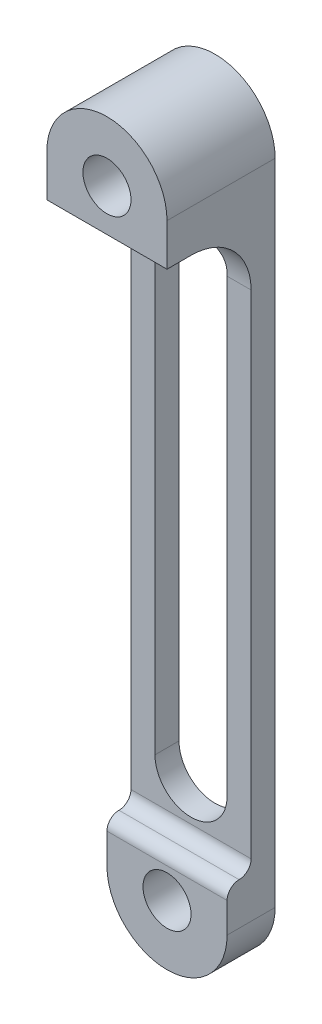
ISO-10303-21;
HEADER;
FILE_DESCRIPTION(('STEP AP214'),'2;1');
FILE_NAME('part.step','',(''),(''),'','','');
FILE_SCHEMA(('AUTOMOTIVE_DESIGN { 1 0 10303 214 1 1 1 1 }'));
ENDSEC;
DATA;
#1=APPLICATION_CONTEXT('core data for automotive mechanical design processes');
#2=APPLICATION_PROTOCOL_DEFINITION('international standard','automotive_design',2000,#1);
#3=PRODUCT_CONTEXT('',#1,'mechanical');
#4=PRODUCT('Part','Part','',(#3));
#5=PRODUCT_RELATED_PRODUCT_CATEGORY('part','',(#4));
#6=PRODUCT_DEFINITION_FORMATION('','',#4);
#7=PRODUCT_DEFINITION_CONTEXT('part definition',#1,'design');
#8=PRODUCT_DEFINITION('design','',#6,#7);
#9=PRODUCT_DEFINITION_SHAPE('','',#8);
#10=(LENGTH_UNIT() NAMED_UNIT(*) SI_UNIT(.MILLI.,.METRE.));
#11=(NAMED_UNIT(*) PLANE_ANGLE_UNIT() SI_UNIT($,.RADIAN.));
#12=(NAMED_UNIT(*) SI_UNIT($,.STERADIAN.) SOLID_ANGLE_UNIT());
#13=UNCERTAINTY_MEASURE_WITH_UNIT(LENGTH_MEASURE(1.E-05),#10,'distance_accuracy_value','');
#14=(GEOMETRIC_REPRESENTATION_CONTEXT(3) GLOBAL_UNCERTAINTY_ASSIGNED_CONTEXT((#13)) GLOBAL_UNIT_ASSIGNED_CONTEXT((#10,
#11,#12)) REPRESENTATION_CONTEXT('',''));
#15=CARTESIAN_POINT('',(0.,0.,0.));
#16=DIRECTION('',(0.,0.,1.));
#17=DIRECTION('',(1.,0.,0.));
#18=AXIS2_PLACEMENT_3D('',#15,#16,#17);
#19=CARTESIAN_POINT('',(0.,0.,4.));
#20=DIRECTION('',(0.,0.,1.));
#21=DIRECTION('',(1.,0.,0.));
#22=AXIS2_PLACEMENT_3D('',#19,#20,#21);
#23=PLANE('',#22);
#24=DIRECTION('',(0.,-1.,0.));
#25=VECTOR('',#24,1.);
#26=CARTESIAN_POINT('',(10.,0.,4.));
#27=LINE('',#26,#25);
#28=CARTESIAN_POINT('',(10.,37.,4.));
#29=VERTEX_POINT('',#28);
#30=CARTESIAN_POINT('',(10.,-45.,4.));
#31=VERTEX_POINT('',#30);
#32=EDGE_CURVE('E302',#29,#31,#27,.T.);
#33=ORIENTED_EDGE('',*,*,#32,.F.);
#34=DIRECTION('',(-1.,0.,0.));
#35=VECTOR('',#34,1.);
#36=CARTESIAN_POINT('',(0.,37.,4.));
#37=LINE('',#36,#35);
#38=CARTESIAN_POINT('',(5.99999999999999,37.,4.));
#39=VERTEX_POINT('',#38);
#40=EDGE_CURVE('E397',#29,#39,#37,.T.);
#41=ORIENTED_EDGE('',*,*,#40,.T.);
#42=DIRECTION('',(0.,-1.,0.));
#43=VECTOR('',#42,1.);
#44=CARTESIAN_POINT('',(5.99999999999999,0.,4.));
#45=LINE('',#44,#43);
#46=CARTESIAN_POINT('',(5.99999999999999,-38.,4.));
#47=VERTEX_POINT('',#46);
#48=EDGE_CURVE('E319',#39,#47,#45,.T.);
#49=ORIENTED_EDGE('',*,*,#48,.T.);
#50=CARTESIAN_POINT('',(0.,-38.,4.));
#51=DIRECTION('',(0.,0.,1.));
#52=DIRECTION('',(1.,0.,0.));
#53=AXIS2_PLACEMENT_3D('',#50,#51,#52);
#54=CIRCLE('',#53,6.00000000000001);
#55=CARTESIAN_POINT('',(-6.00000000000002,-38.,4.));
#56=VERTEX_POINT('',#55);
#57=EDGE_CURVE('E311',#56,#47,#54,.T.);
#58=ORIENTED_EDGE('',*,*,#57,.F.);
#59=DIRECTION('',(0.,-1.,0.));
#60=VECTOR('',#59,1.);
#61=CARTESIAN_POINT('',(-6.00000000000002,0.,4.));
#62=LINE('',#61,#60);
#63=CARTESIAN_POINT('',(-6.00000000000002,37.,4.));
#64=VERTEX_POINT('',#63);
#65=EDGE_CURVE('E314',#64,#56,#62,.T.);
#66=ORIENTED_EDGE('',*,*,#65,.F.);
#67=DIRECTION('',(-1.,0.,0.));
#68=VECTOR('',#67,1.);
#69=CARTESIAN_POINT('',(0.,37.,4.));
#70=LINE('',#69,#68);
#71=CARTESIAN_POINT('',(-9.99999999999999,37.,4.));
#72=VERTEX_POINT('',#71);
#73=EDGE_CURVE('E396',#64,#72,#70,.T.);
#74=ORIENTED_EDGE('',*,*,#73,.T.);
#75=DIRECTION('',(0.,-1.,0.));
#76=VECTOR('',#75,1.);
#77=CARTESIAN_POINT('',(-9.99999999999999,0.,4.));
#78=LINE('',#77,#76);
#79=CARTESIAN_POINT('',(-9.99999999999999,-45.,4.));
#80=VERTEX_POINT('',#79);
#81=EDGE_CURVE('E310',#72,#80,#78,.T.);
#82=ORIENTED_EDGE('',*,*,#81,.T.);
#83=DIRECTION('',(-1.,0.,0.));
#84=VECTOR('',#83,1.);
#85=CARTESIAN_POINT('',(10.,-45.,4.));
#86=LINE('',#85,#84);
#87=EDGE_CURVE('E378',#80,#31,#86,.F.);
#88=ORIENTED_EDGE('',*,*,#87,.T.);
#89=EDGE_LOOP('',(#33,#41,#49,#58,#66,#74,#82,#88));
#90=FACE_BOUND('',#89,.T.);
#91=ADVANCED_FACE('F134',(#90),#23,.T.);
#92=CARTESIAN_POINT('',(0.,0.,0.));
#93=DIRECTION('',(0.,0.,1.));
#94=DIRECTION('',(1.,0.,0.));
#95=AXIS2_PLACEMENT_3D('',#92,#93,#94);
#96=PLANE('',#95);
#97=DIRECTION('',(0.,-1.,0.));
#98=VECTOR('',#97,1.);
#99=CARTESIAN_POINT('',(10.,0.,0.));
#100=LINE('',#99,#98);
#101=CARTESIAN_POINT('',(10.,54.,0.));
#102=VERTEX_POINT('',#101);
#103=CARTESIAN_POINT('',(9.99999999999999,-54.,0.));
#104=VERTEX_POINT('',#103);
#105=EDGE_CURVE('E248',#102,#104,#100,.T.);
#106=ORIENTED_EDGE('',*,*,#105,.T.);
#107=CARTESIAN_POINT('',(0.,-54.,0.));
#108=DIRECTION('',(0.,0.,1.));
#109=DIRECTION('',(1.,0.,0.));
#110=AXIS2_PLACEMENT_3D('',#107,#108,#109);
#111=CIRCLE('',#110,10.);
#112=CARTESIAN_POINT('',(-9.99999999999999,-54.,0.));
#113=VERTEX_POINT('',#112);
#114=EDGE_CURVE('E359',#113,#104,#111,.T.);
#115=ORIENTED_EDGE('',*,*,#114,.F.);
#116=DIRECTION('',(0.,-1.,0.));
#117=VECTOR('',#116,1.);
#118=CARTESIAN_POINT('',(-9.99999999999999,0.,0.));
#119=LINE('',#118,#117);
#120=CARTESIAN_POINT('',(-9.99999999999999,54.,0.));
#121=VERTEX_POINT('',#120);
#122=EDGE_CURVE('E330',#121,#113,#119,.T.);
#123=ORIENTED_EDGE('',*,*,#122,.F.);
#124=CARTESIAN_POINT('',(0.,54.,0.));
#125=DIRECTION('',(0.,0.,1.));
#126=DIRECTION('',(1.,0.,0.));
#127=AXIS2_PLACEMENT_3D('',#124,#125,#126);
#128=CIRCLE('',#127,10.);
#129=EDGE_CURVE('E324',#102,#121,#128,.T.);
#130=ORIENTED_EDGE('',*,*,#129,.F.);
#131=EDGE_LOOP('',(#106,#115,#123,#130));
#132=FACE_BOUND('',#131,.T.);
#133=CARTESIAN_POINT('',(0.,-38.,0.));
#134=DIRECTION('',(0.,0.,1.));
#135=DIRECTION('',(1.,0.,0.));
#136=AXIS2_PLACEMENT_3D('',#133,#134,#135);
#137=CIRCLE('',#136,6.00000000000001);
#138=CARTESIAN_POINT('',(-6.00000000000002,-38.,0.));
#139=VERTEX_POINT('',#138);
#140=CARTESIAN_POINT('',(5.99999999999999,-38.,0.));
#141=VERTEX_POINT('',#140);
#142=EDGE_CURVE('E327',#139,#141,#137,.T.);
#143=ORIENTED_EDGE('',*,*,#142,.T.);
#144=DIRECTION('',(0.,-1.,0.));
#145=VECTOR('',#144,1.);
#146=CARTESIAN_POINT('',(5.99999999999999,0.,0.));
#147=LINE('',#146,#145);
#148=CARTESIAN_POINT('',(5.99999999999999,38.,0.));
#149=VERTEX_POINT('',#148);
#150=EDGE_CURVE('E308',#149,#141,#147,.T.);
#151=ORIENTED_EDGE('',*,*,#150,.F.);
#152=CARTESIAN_POINT('',(0.,38.,0.));
#153=DIRECTION('',(0.,0.,1.));
#154=DIRECTION('',(1.,0.,0.));
#155=AXIS2_PLACEMENT_3D('',#152,#153,#154);
#156=CIRCLE('',#155,6.00000000000001);
#157=CARTESIAN_POINT('',(-6.00000000000002,38.,0.));
#158=VERTEX_POINT('',#157);
#159=EDGE_CURVE('E336',#149,#158,#156,.T.);
#160=ORIENTED_EDGE('',*,*,#159,.T.);
#161=DIRECTION('',(0.,-1.,0.));
#162=VECTOR('',#161,1.);
#163=CARTESIAN_POINT('',(-6.00000000000002,0.,0.));
#164=LINE('',#163,#162);
#165=EDGE_CURVE('E333',#158,#139,#164,.T.);
#166=ORIENTED_EDGE('',*,*,#165,.T.);
#167=EDGE_LOOP('',(#143,#151,#160,#166));
#168=FACE_BOUND('',#167,.T.);
#169=CARTESIAN_POINT('',(0.,-54.,0.));
#170=DIRECTION('',(0.,0.,1.));
#171=DIRECTION('',(1.,0.,0.));
#172=AXIS2_PLACEMENT_3D('',#169,#170,#171);
#173=CIRCLE('',#172,4.);
#174=CARTESIAN_POINT('',(3.99999999999999,-54.,0.));
#175=VERTEX_POINT('',#174);
#176=EDGE_CURVE('E303',#175,#175,#173,.T.);
#177=ORIENTED_EDGE('',*,*,#176,.T.);
#178=EDGE_LOOP('',(#177));
#179=FACE_BOUND('',#178,.T.);
#180=ADVANCED_FACE('F433',(#132,#168,#179),#96,.F.);
#181=CARTESIAN_POINT('',(5.99999999999999,0.,4.));
#182=DIRECTION('',(1.,0.,0.));
#183=DIRECTION('',(0.,0.,-1.));
#184=AXIS2_PLACEMENT_3D('',#181,#182,#183);
#185=PLANE('',#184);
#186=ORIENTED_EDGE('',*,*,#150,.T.);
#187=DIRECTION('',(0.,0.,-1.));
#188=VECTOR('',#187,1.);
#189=CARTESIAN_POINT('',(5.99999999999999,-38.,4.));
#190=LINE('',#189,#188);
#191=EDGE_CURVE('E251',#47,#141,#190,.T.);
#192=ORIENTED_EDGE('',*,*,#191,.F.);
#193=ORIENTED_EDGE('',*,*,#48,.F.);
#194=CARTESIAN_POINT('',(5.99999999999999,37.,14.));
#195=DIRECTION('',(1.,0.,0.));
#196=DIRECTION('',(0.,0.,-1.));
#197=AXIS2_PLACEMENT_3D('',#194,#195,#196);
#198=CIRCLE('',#197,10.);
#199=CARTESIAN_POINT('',(5.99999999999999,38.,4.0501256289338));
#200=VERTEX_POINT('',#199);
#201=EDGE_CURVE('E410',#39,#200,#198,.T.);
#202=ORIENTED_EDGE('',*,*,#201,.T.);
#203=DIRECTION('',(0.,0.,-1.));
#204=VECTOR('',#203,1.);
#205=CARTESIAN_POINT('',(5.99999999999999,38.,4.));
#206=LINE('',#205,#204);
#207=EDGE_CURVE('E160',#200,#149,#206,.T.);
#208=ORIENTED_EDGE('',*,*,#207,.T.);
#209=EDGE_LOOP('',(#186,#192,#193,#202,#208));
#210=FACE_BOUND('',#209,.T.);
#211=ADVANCED_FACE('F424',(#210),#185,.F.);
#212=CARTESIAN_POINT('',(0.,-38.,4.));
#213=DIRECTION('',(0.,0.,-1.));
#214=DIRECTION('',(-1.,0.,0.));
#215=AXIS2_PLACEMENT_3D('',#212,#213,#214);
#216=CYLINDRICAL_SURFACE('',#215,6.00000000000001);
#217=ORIENTED_EDGE('',*,*,#142,.F.);
#218=DIRECTION('',(0.,0.,-1.));
#219=VECTOR('',#218,1.);
#220=CARTESIAN_POINT('',(-6.00000000000002,-38.,4.));
#221=LINE('',#220,#219);
#222=EDGE_CURVE('E354',#56,#139,#221,.T.);
#223=ORIENTED_EDGE('',*,*,#222,.F.);
#224=ORIENTED_EDGE('',*,*,#57,.T.);
#225=ORIENTED_EDGE('',*,*,#191,.T.);
#226=EDGE_LOOP('',(#217,#223,#224,#225));
#227=FACE_BOUND('',#226,.T.);
#228=ADVANCED_FACE('F429',(#227),#216,.F.);
#229=CARTESIAN_POINT('',(-6.00000000000002,0.,4.));
#230=DIRECTION('',(1.,0.,0.));
#231=DIRECTION('',(0.,0.,-1.));
#232=AXIS2_PLACEMENT_3D('',#229,#230,#231);
#233=PLANE('',#232);
#234=ORIENTED_EDGE('',*,*,#165,.F.);
#235=DIRECTION('',(0.,0.,-1.));
#236=VECTOR('',#235,1.);
#237=CARTESIAN_POINT('',(-6.00000000000002,38.,4.));
#238=LINE('',#237,#236);
#239=CARTESIAN_POINT('',(-6.00000000000002,38.,4.0501256289338));
#240=VERTEX_POINT('',#239);
#241=EDGE_CURVE('E153',#240,#158,#238,.T.);
#242=ORIENTED_EDGE('',*,*,#241,.F.);
#243=CARTESIAN_POINT('',(-6.00000000000002,37.,14.));
#244=DIRECTION('',(1.,0.,0.));
#245=DIRECTION('',(0.,0.,-1.));
#246=AXIS2_PLACEMENT_3D('',#243,#244,#245);
#247=CIRCLE('',#246,10.);
#248=EDGE_CURVE('E420',#240,#64,#247,.F.);
#249=ORIENTED_EDGE('',*,*,#248,.T.);
#250=ORIENTED_EDGE('',*,*,#65,.T.);
#251=ORIENTED_EDGE('',*,*,#222,.T.);
#252=EDGE_LOOP('',(#234,#242,#249,#250,#251));
#253=FACE_BOUND('',#252,.T.);
#254=ADVANCED_FACE('F425',(#253),#233,.T.);
#255=CARTESIAN_POINT('',(0.,38.,4.));
#256=DIRECTION('',(0.,0.,-1.));
#257=DIRECTION('',(-1.,0.,0.));
#258=AXIS2_PLACEMENT_3D('',#255,#256,#257);
#259=CYLINDRICAL_SURFACE('',#258,6.00000000000001);
#260=ORIENTED_EDGE('',*,*,#159,.F.);
#261=ORIENTED_EDGE('',*,*,#207,.F.);
#262=CARTESIAN_POINT('',(5.99999999999999,38.,4.0501256289338));
#263=CARTESIAN_POINT('',(6.0000294951596,38.1591175187493,4.06608293057429));
#264=CARTESIAN_POINT('',(5.99367212509251,38.3178105674028,4.08592065296171));
#265=CARTESIAN_POINT('',(5.96860004965311,38.6330020197956,4.13295942524133));
#266=CARTESIAN_POINT('',(5.94989436154212,38.7895019399501,4.16015509350608));
#267=CARTESIAN_POINT('',(5.90069490388108,39.0982307316092,4.22134509223627));
#268=CARTESIAN_POINT('',(5.87027543348815,39.2504801632662,4.25529593229296));
#269=CARTESIAN_POINT('',(5.7981979236528,39.5507212780291,4.32954337511306));
#270=CARTESIAN_POINT('',(5.75653821567016,39.6987123253931,4.36984091963352));
#271=CARTESIAN_POINT('',(5.66273347676998,39.9891372133211,4.45600022435041));
#272=CARTESIAN_POINT('',(5.61061972958902,40.1315861551653,4.50184522510344));
#273=CARTESIAN_POINT('',(5.49646333293458,40.410737683907,4.59847226930764));
#274=CARTESIAN_POINT('',(5.43441688028624,40.5474380442883,4.64925620091144));
#275=CARTESIAN_POINT('',(5.23419168500289,40.9482931524451,4.80796840596734));
#276=CARTESIAN_POINT('',(5.08196517314529,41.2030861169894,4.92222183327461));
#277=CARTESIAN_POINT('',(4.72700902510743,41.7095847876954,5.17344560921815));
#278=CARTESIAN_POINT('',(4.52065498084985,41.9581576138449,5.311541599));
#279=CARTESIAN_POINT('',(4.07151863059318,42.4188676858128,5.59116780926577));
#280=CARTESIAN_POINT('',(3.82866845263922,42.6309354324219,5.73270400751313));
#281=CARTESIAN_POINT('',(3.42157838573368,42.9321887492625,5.94846075171384));
#282=CARTESIAN_POINT('',(3.26861110983556,43.0349235630671,6.02538504951066));
#283=CARTESIAN_POINT('',(2.95199395538532,43.2268537011576,6.17433589210791));
#284=CARTESIAN_POINT('',(2.78834099569062,43.3160450954189,6.2463610119323));
#285=CARTESIAN_POINT('',(2.45130504733917,43.4796072515253,6.38252058251944));
#286=CARTESIAN_POINT('',(2.27795188895556,43.5540205602045,6.44667747615086));
#287=CARTESIAN_POINT('',(1.92182067944011,43.6870608145333,6.56420100149436));
#288=CARTESIAN_POINT('',(1.73905022937201,43.7457002612277,6.61757616949508));
#289=CARTESIAN_POINT('',(1.43397156489431,43.8274126503987,6.6932702328874));
#290=CARTESIAN_POINT('',(1.31406535169195,43.8556429960359,6.71980054156605));
#291=CARTESIAN_POINT('',(1.07155591266237,43.9048336605978,6.76643763775028));
#292=CARTESIAN_POINT('',(0.948953551335206,43.92579627474,6.78654645306488));
#293=CARTESIAN_POINT('',(0.701890617956236,43.9601077108383,6.81964687541727));
#294=CARTESIAN_POINT('',(0.577432595240377,43.973466139441,6.83264746171744));
#295=CARTESIAN_POINT('',(0.327356567361795,43.9923751001517,6.85109330345357));
#296=CARTESIAN_POINT('',(0.201738529570265,43.9979254119561,6.8565383457122));
#297=CARTESIAN_POINT('',(-0.0499724301037092,44.0011148465854,6.85966412555106));
#298=CARTESIAN_POINT('',(-0.176065788765368,43.9987365405341,6.8573277578616));
#299=CARTESIAN_POINT('',(-0.427466693636261,43.9860767055142,6.8449452031245));
#300=CARTESIAN_POINT('',(-0.552774253039173,43.9757953095997,6.8348991458749));
#301=CARTESIAN_POINT('',(-0.801796803030101,43.9475069706706,6.80746687048065));
#302=CARTESIAN_POINT('',(-0.925510420988328,43.9294937748418,6.79007471162358));
#303=CARTESIAN_POINT('',(-1.17052168133062,43.8860320042462,6.74855441795779));
#304=CARTESIAN_POINT('',(-1.29181807779596,43.8605796958445,6.72442290098697));
#305=CARTESIAN_POINT('',(-1.55981238132584,43.795708710444,6.66373683110122));
#306=CARTESIAN_POINT('',(-1.70569646846691,43.7544084110676,6.62559283290449));
#307=CARTESIAN_POINT('',(-1.99202862151977,43.6616692511934,6.54171152006149));
#308=CARTESIAN_POINT('',(-2.1324726967012,43.6102231102552,6.49596875644075));
#309=CARTESIAN_POINT('',(-2.40757233010485,43.4977916186078,6.39840481262958));
#310=CARTESIAN_POINT('',(-2.54221802081884,43.4367907670592,6.3465737900893));
#311=CARTESIAN_POINT('',(-2.80513700162622,43.3059181214778,6.23838906480572));
#312=CARTESIAN_POINT('',(-2.93341239355271,43.2360492807928,6.18203687005764));
#313=CARTESIAN_POINT('',(-3.2160799982645,43.0685700626666,6.05100595078985));
#314=CARTESIAN_POINT('',(-3.36856518766068,42.9684755355649,5.97537877212671));
#315=CARTESIAN_POINT('',(-3.662942511868,42.7556130837321,5.82135778945502));
#316=CARTESIAN_POINT('',(-3.80483215528341,42.6428421938493,5.74296334110324));
#317=CARTESIAN_POINT('',(-4.07773930855389,42.4050894553705,5.58540787567962));
#318=CARTESIAN_POINT('',(-4.20874879444984,42.2800987401617,5.50624634010113));
#319=CARTESIAN_POINT('',(-4.45926102297536,42.0184315999573,5.3490672283874));
#320=CARTESIAN_POINT('',(-4.57876475258685,41.8817561791966,5.27104955461745));
#321=CARTESIAN_POINT('',(-4.8062789682288,41.5962753489477,5.11739403190589));
#322=CARTESIAN_POINT('',(-4.91421511860866,41.4474012099078,5.04177354638658));
#323=CARTESIAN_POINT('',(-5.11683605940352,41.1387974105401,4.8950818422026));
#324=CARTESIAN_POINT('',(-5.21152288702919,40.9790694247188,4.82400992506576));
#325=CARTESIAN_POINT('',(-5.38631824137914,40.649941477627,4.68820510923198));
#326=CARTESIAN_POINT('',(-5.46646945196341,40.4805718189937,4.62345391705684));
#327=CARTESIAN_POINT('',(-5.61132116732317,40.1327301449577,4.50158284717902));
#328=CARTESIAN_POINT('',(-5.67602624792147,39.9542608443301,4.44446071162887));
#329=CARTESIAN_POINT('',(-5.77574769459048,39.6316568969812,4.35138795932134));
#330=CARTESIAN_POINT('',(-5.8141694886886,39.4890977430194,4.31359303058179));
#331=CARTESIAN_POINT('',(-5.88060418386199,39.200190034776,4.24391278426973));
#332=CARTESIAN_POINT('',(-5.90862038748129,39.0538426985954,4.21202559330242));
#333=CARTESIAN_POINT('',(-5.95391289001359,38.7573184776507,4.15445585240362));
#334=CARTESIAN_POINT('',(-5.97112145039857,38.6071234618042,4.12881304114627));
#335=CARTESIAN_POINT('',(-5.99418207495812,38.3047491695015,4.0842974092484));
#336=CARTESIAN_POINT('',(-6.00002491238777,38.1525683817848,4.06543009911202));
#337=CARTESIAN_POINT('',(-6.00000000000001,38.,4.0501256289338));
#338=B_SPLINE_CURVE_WITH_KNOTS('',3,(#262,#263,#264,#265,#266,#267,#268,#269,#270,#271,#272,
#273,#274,#275,#276,#277,#278,#279,#280,#281,#282,#283,#284,#285,#286,#287,#288,#289,#290,#291,
#292,#293,#294,#295,#296,#297,#298,#299,#300,#301,#302,#303,#304,#305,#306,#307,#308,#309,#310,
#311,#312,#313,#314,#315,#316,#317,#318,#319,#320,#321,#322,#323,#324,#325,#326,#327,#328,#329,
#330,#331,#332,#333,#334,#335,#336,#337),.UNSPECIFIED.,.F.,.F.,(4,2,2,2,2,2,2,2,2,2,2,2,2,2,2,2,
2,2,2,2,2,2,2,2,2,2,2,2,2,2,2,2,2,2,2,2,2,4),(0.,0.479521694057924,0.958693607982544,
1.4348749640435,1.9111270450595,2.38597464886377,2.86100450583572,3.81144088218074,
4.86166678762596,5.91387053962458,6.51224019448164,7.11078315356829,7.70757706674632,
8.30389660809757,8.68157362710421,9.05913126329832,9.43621085241886,9.81330108050651,
10.1912207834066,10.5691341239017,10.9473536657053,11.3257633599833,11.7941017538637,
12.2627774483357,12.7322215161025,13.2015096509353,13.7931124981155,14.3848540173184,
14.9770281321084,15.569151403925,16.1648765737993,16.7605100443156,17.3543650680643,
17.9480439469148,18.4047868716972,18.8613847105076,19.3208165105854,19.7806211240662),.UNSPECIFIED.);
#339=EDGE_CURVE('E408',#200,#240,#338,.T.);
#340=ORIENTED_EDGE('',*,*,#339,.T.);
#341=ORIENTED_EDGE('',*,*,#241,.T.);
#342=EDGE_LOOP('',(#260,#261,#340,#341));
#343=FACE_BOUND('',#342,.T.);
#344=ADVANCED_FACE('F418',(#343),#259,.F.);
#345=CARTESIAN_POINT('',(10.,0.,4.));
#346=DIRECTION('',(1.,0.,0.));
#347=DIRECTION('',(0.,0.,-1.));
#348=AXIS2_PLACEMENT_3D('',#345,#346,#347);
#349=PLANE('',#348);
#350=DIRECTION('',(0.,0.,-1.));
#351=VECTOR('',#350,1.);
#352=CARTESIAN_POINT('',(9.99999999999999,-54.,4.));
#353=LINE('',#352,#351);
#354=CARTESIAN_POINT('',(10.,-54.,8.));
#355=VERTEX_POINT('',#354);
#356=EDGE_CURVE('E364',#355,#104,#353,.T.);
#357=ORIENTED_EDGE('',*,*,#356,.T.);
#358=ORIENTED_EDGE('',*,*,#105,.F.);
#359=DIRECTION('',(0.,0.,-1.));
#360=VECTOR('',#359,1.);
#361=CARTESIAN_POINT('',(10.,54.,4.));
#362=LINE('',#361,#360);
#363=CARTESIAN_POINT('',(10.,54.,18.));
#364=VERTEX_POINT('',#363);
#365=EDGE_CURVE('E245',#364,#102,#362,.T.);
#366=ORIENTED_EDGE('',*,*,#365,.F.);
#367=DIRECTION('',(0.,-1.,0.));
#368=VECTOR('',#367,1.);
#369=CARTESIAN_POINT('',(10.,0.,18.));
#370=LINE('',#369,#368);
#371=CARTESIAN_POINT('',(10.,47.,18.));
#372=VERTEX_POINT('',#371);
#373=EDGE_CURVE('E247',#364,#372,#370,.T.);
#374=ORIENTED_EDGE('',*,*,#373,.T.);
#375=DIRECTION('',(0.,0.,-1.));
#376=VECTOR('',#375,1.);
#377=CARTESIAN_POINT('',(10.,47.,18.));
#378=LINE('',#377,#376);
#379=CARTESIAN_POINT('',(10.,47.,14.));
#380=VERTEX_POINT('',#379);
#381=EDGE_CURVE('E283',#372,#380,#378,.T.);
#382=ORIENTED_EDGE('',*,*,#381,.T.);
#383=CARTESIAN_POINT('',(10.,37.,14.));
#384=DIRECTION('',(1.,0.,0.));
#385=DIRECTION('',(0.,0.,-1.));
#386=AXIS2_PLACEMENT_3D('',#383,#384,#385);
#387=CIRCLE('',#386,10.);
#388=EDGE_CURVE('E12',#380,#29,#387,.F.);
#389=ORIENTED_EDGE('',*,*,#388,.T.);
#390=ORIENTED_EDGE('',*,*,#32,.T.);
#391=CARTESIAN_POINT('',(10.,-45.,6.));
#392=DIRECTION('',(1.,0.,0.));
#393=DIRECTION('',(0.,0.,-1.));
#394=AXIS2_PLACEMENT_3D('',#391,#392,#393);
#395=CIRCLE('',#394,2.);
#396=CARTESIAN_POINT('',(10.,-47.,6.));
#397=VERTEX_POINT('',#396);
#398=EDGE_CURVE('E390',#31,#397,#395,.F.);
#399=ORIENTED_EDGE('',*,*,#398,.T.);
#400=CARTESIAN_POINT('',(10.,-49.,6.));
#401=DIRECTION('',(1.,0.,0.));
#402=DIRECTION('',(0.,0.,-1.));
#403=AXIS2_PLACEMENT_3D('',#400,#401,#402);
#404=CIRCLE('',#403,2.);
#405=CARTESIAN_POINT('',(10.,-49.,8.));
#406=VERTEX_POINT('',#405);
#407=EDGE_CURVE('E353',#397,#406,#404,.T.);
#408=ORIENTED_EDGE('',*,*,#407,.T.);
#409=DIRECTION('',(0.,-1.,0.));
#410=VECTOR('',#409,1.);
#411=CARTESIAN_POINT('',(10.,0.,8.));
#412=LINE('',#411,#410);
#413=EDGE_CURVE('E297',#406,#355,#412,.T.);
#414=ORIENTED_EDGE('',*,*,#413,.T.);
#415=EDGE_LOOP('',(#357,#358,#366,#374,#382,#389,#390,#399,#408,#414));
#416=FACE_BOUND('',#415,.T.);
#417=ADVANCED_FACE('F244',(#416),#349,.T.);
#418=CARTESIAN_POINT('',(-9.99999999999999,0.,4.));
#419=DIRECTION('',(1.,0.,0.));
#420=DIRECTION('',(0.,0.,-1.));
#421=AXIS2_PLACEMENT_3D('',#418,#419,#420);
#422=PLANE('',#421);
#423=ORIENTED_EDGE('',*,*,#81,.F.);
#424=CARTESIAN_POINT('',(-9.99999999999999,37.,14.));
#425=DIRECTION('',(1.,0.,0.));
#426=DIRECTION('',(0.,0.,-1.));
#427=AXIS2_PLACEMENT_3D('',#424,#425,#426);
#428=CIRCLE('',#427,10.);
#429=CARTESIAN_POINT('',(-9.99999999999999,47.,14.));
#430=VERTEX_POINT('',#429);
#431=EDGE_CURVE('E144',#72,#430,#428,.T.);
#432=ORIENTED_EDGE('',*,*,#431,.T.);
#433=DIRECTION('',(0.,0.,-1.));
#434=VECTOR('',#433,1.);
#435=CARTESIAN_POINT('',(-9.99999999999999,47.,18.));
#436=LINE('',#435,#434);
#437=CARTESIAN_POINT('',(-9.99999999999999,47.,18.));
#438=VERTEX_POINT('',#437);
#439=EDGE_CURVE('E284',#438,#430,#436,.T.);
#440=ORIENTED_EDGE('',*,*,#439,.F.);
#441=DIRECTION('',(0.,-1.,0.));
#442=VECTOR('',#441,1.);
#443=CARTESIAN_POINT('',(-9.99999999999999,0.,18.));
#444=LINE('',#443,#442);
#445=CARTESIAN_POINT('',(-9.99999999999999,54.,18.));
#446=VERTEX_POINT('',#445);
#447=EDGE_CURVE('E262',#446,#438,#444,.T.);
#448=ORIENTED_EDGE('',*,*,#447,.F.);
#449=DIRECTION('',(0.,0.,-1.));
#450=VECTOR('',#449,1.);
#451=CARTESIAN_POINT('',(-9.99999999999999,54.,4.));
#452=LINE('',#451,#450);
#453=EDGE_CURVE('E253',#446,#121,#452,.T.);
#454=ORIENTED_EDGE('',*,*,#453,.T.);
#455=ORIENTED_EDGE('',*,*,#122,.T.);
#456=DIRECTION('',(0.,0.,-1.));
#457=VECTOR('',#456,1.);
#458=CARTESIAN_POINT('',(-9.99999999999999,-54.,4.));
#459=LINE('',#458,#457);
#460=CARTESIAN_POINT('',(-9.99999999999999,-54.,8.));
#461=VERTEX_POINT('',#460);
#462=EDGE_CURVE('E321',#461,#113,#459,.T.);
#463=ORIENTED_EDGE('',*,*,#462,.F.);
#464=DIRECTION('',(0.,-1.,0.));
#465=VECTOR('',#464,1.);
#466=CARTESIAN_POINT('',(-9.99999999999999,0.,8.));
#467=LINE('',#466,#465);
#468=CARTESIAN_POINT('',(-9.99999999999999,-49.,8.));
#469=VERTEX_POINT('',#468);
#470=EDGE_CURVE('E291',#469,#461,#467,.T.);
#471=ORIENTED_EDGE('',*,*,#470,.F.);
#472=CARTESIAN_POINT('',(-9.99999999999999,-49.,6.));
#473=DIRECTION('',(1.,0.,0.));
#474=DIRECTION('',(0.,0.,-1.));
#475=AXIS2_PLACEMENT_3D('',#472,#473,#474);
#476=CIRCLE('',#475,2.);
#477=CARTESIAN_POINT('',(-9.99999999999999,-47.,6.));
#478=VERTEX_POINT('',#477);
#479=EDGE_CURVE('E376',#469,#478,#476,.F.);
#480=ORIENTED_EDGE('',*,*,#479,.T.);
#481=CARTESIAN_POINT('',(-9.99999999999999,-45.,6.));
#482=DIRECTION('',(1.,0.,0.));
#483=DIRECTION('',(0.,0.,-1.));
#484=AXIS2_PLACEMENT_3D('',#481,#482,#483);
#485=CIRCLE('',#484,2.);
#486=EDGE_CURVE('E384',#478,#80,#485,.T.);
#487=ORIENTED_EDGE('',*,*,#486,.T.);
#488=EDGE_LOOP('',(#423,#432,#440,#448,#454,#455,#463,#471,#480,#487));
#489=FACE_BOUND('',#488,.T.);
#490=ADVANCED_FACE('F432',(#489),#422,.F.);
#491=CARTESIAN_POINT('',(0.,54.,4.));
#492=DIRECTION('',(0.,0.,-1.));
#493=DIRECTION('',(-1.,0.,0.));
#494=AXIS2_PLACEMENT_3D('',#491,#492,#493);
#495=CYLINDRICAL_SURFACE('',#494,10.);
#496=ORIENTED_EDGE('',*,*,#129,.T.);
#497=ORIENTED_EDGE('',*,*,#453,.F.);
#498=CARTESIAN_POINT('',(0.,54.,18.));
#499=DIRECTION('',(0.,0.,1.));
#500=DIRECTION('',(1.,0.,0.));
#501=AXIS2_PLACEMENT_3D('',#498,#499,#500);
#502=CIRCLE('',#501,10.);
#503=EDGE_CURVE('E259',#364,#446,#502,.T.);
#504=ORIENTED_EDGE('',*,*,#503,.F.);
#505=ORIENTED_EDGE('',*,*,#365,.T.);
#506=EDGE_LOOP('',(#496,#497,#504,#505));
#507=FACE_BOUND('',#506,.T.);
#508=ADVANCED_FACE('F256',(#507),#495,.T.);
#509=CARTESIAN_POINT('',(0.,-54.,4.));
#510=DIRECTION('',(0.,0.,-1.));
#511=DIRECTION('',(-1.,0.,0.));
#512=AXIS2_PLACEMENT_3D('',#509,#510,#511);
#513=CYLINDRICAL_SURFACE('',#512,4.);
#514=ORIENTED_EDGE('',*,*,#176,.F.);
#515=EDGE_LOOP('',(#514));
#516=FACE_BOUND('',#515,.T.);
#517=CARTESIAN_POINT('',(0.,-54.,8.));
#518=DIRECTION('',(0.,0.,1.));
#519=DIRECTION('',(1.,0.,0.));
#520=AXIS2_PLACEMENT_3D('',#517,#518,#519);
#521=CIRCLE('',#520,4.);
#522=CARTESIAN_POINT('',(3.99999999999999,-54.,8.));
#523=VERTEX_POINT('',#522);
#524=EDGE_CURVE('E288',#523,#523,#521,.T.);
#525=ORIENTED_EDGE('',*,*,#524,.T.);
#526=EDGE_LOOP('',(#525));
#527=FACE_BOUND('',#526,.T.);
#528=ADVANCED_FACE('F439',(#516,#527),#513,.F.);
#529=CARTESIAN_POINT('',(0.,-54.,4.));
#530=DIRECTION('',(0.,0.,-1.));
#531=DIRECTION('',(-1.,0.,0.));
#532=AXIS2_PLACEMENT_3D('',#529,#530,#531);
#533=CYLINDRICAL_SURFACE('',#532,10.);
#534=ORIENTED_EDGE('',*,*,#114,.T.);
#535=ORIENTED_EDGE('',*,*,#356,.F.);
#536=CARTESIAN_POINT('',(0.,-54.,8.));
#537=DIRECTION('',(0.,0.,1.));
#538=DIRECTION('',(1.,0.,0.));
#539=AXIS2_PLACEMENT_3D('',#536,#537,#538);
#540=CIRCLE('',#539,10.);
#541=EDGE_CURVE('E298',#461,#355,#540,.T.);
#542=ORIENTED_EDGE('',*,*,#541,.F.);
#543=ORIENTED_EDGE('',*,*,#462,.T.);
#544=EDGE_LOOP('',(#534,#535,#542,#543));
#545=FACE_BOUND('',#544,.T.);
#546=ADVANCED_FACE('F444',(#545),#533,.T.);
#547=CARTESIAN_POINT('',(0.,0.,8.));
#548=DIRECTION('',(0.,0.,1.));
#549=DIRECTION('',(1.,0.,0.));
#550=AXIS2_PLACEMENT_3D('',#547,#548,#549);
#551=PLANE('',#550);
#552=ORIENTED_EDGE('',*,*,#524,.F.);
#553=EDGE_LOOP('',(#552));
#554=FACE_BOUND('',#553,.T.);
#555=ORIENTED_EDGE('',*,*,#413,.F.);
#556=DIRECTION('',(1.,0.,0.));
#557=VECTOR('',#556,1.);
#558=CARTESIAN_POINT('',(0.,-49.,8.));
#559=LINE('',#558,#557);
#560=EDGE_CURVE('E375',#406,#469,#559,.F.);
#561=ORIENTED_EDGE('',*,*,#560,.T.);
#562=ORIENTED_EDGE('',*,*,#470,.T.);
#563=ORIENTED_EDGE('',*,*,#541,.T.);
#564=EDGE_LOOP('',(#555,#561,#562,#563));
#565=FACE_BOUND('',#564,.T.);
#566=ADVANCED_FACE('F446',(#554,#565),#551,.T.);
#567=CARTESIAN_POINT('',(0.,-45.,6.));
#568=DIRECTION('',(1.,0.,0.));
#569=DIRECTION('',(0.,0.,-1.));
#570=AXIS2_PLACEMENT_3D('',#567,#568,#569);
#571=CYLINDRICAL_SURFACE('',#570,2.);
#572=ORIENTED_EDGE('',*,*,#87,.F.);
#573=ORIENTED_EDGE('',*,*,#486,.F.);
#574=DIRECTION('',(-1.,0.,0.));
#575=VECTOR('',#574,1.);
#576=CARTESIAN_POINT('',(-9.99999999999999,-47.,6.));
#577=LINE('',#576,#575);
#578=EDGE_CURVE('E290',#397,#478,#577,.T.);
#579=ORIENTED_EDGE('',*,*,#578,.F.);
#580=ORIENTED_EDGE('',*,*,#398,.F.);
#581=EDGE_LOOP('',(#572,#573,#579,#580));
#582=FACE_BOUND('',#581,.T.);
#583=ADVANCED_FACE('F451',(#582),#571,.F.);
#584=CARTESIAN_POINT('',(0.,-49.,6.));
#585=DIRECTION('',(1.,0.,0.));
#586=DIRECTION('',(0.,0.,-1.));
#587=AXIS2_PLACEMENT_3D('',#584,#585,#586);
#588=CYLINDRICAL_SURFACE('',#587,2.);
#589=ORIENTED_EDGE('',*,*,#479,.F.);
#590=ORIENTED_EDGE('',*,*,#560,.F.);
#591=ORIENTED_EDGE('',*,*,#407,.F.);
#592=ORIENTED_EDGE('',*,*,#578,.T.);
#593=EDGE_LOOP('',(#589,#590,#591,#592));
#594=FACE_BOUND('',#593,.T.);
#595=ADVANCED_FACE('F452',(#594),#588,.T.);
#596=CARTESIAN_POINT('',(0.,54.,18.));
#597=DIRECTION('',(0.,0.,-1.));
#598=DIRECTION('',(-1.,0.,0.));
#599=AXIS2_PLACEMENT_3D('',#596,#597,#598);
#600=CYLINDRICAL_SURFACE('',#599,4.);
#601=CARTESIAN_POINT('',(0.,54.,4.));
#602=DIRECTION('',(0.,0.,1.));
#603=DIRECTION('',(1.,0.,0.));
#604=AXIS2_PLACEMENT_3D('',#601,#602,#603);
#605=CIRCLE('',#604,4.);
#606=CARTESIAN_POINT('',(3.99999999999999,54.,4.));
#607=VERTEX_POINT('',#606);
#608=EDGE_CURVE('E388',#607,#607,#605,.F.);
#609=ORIENTED_EDGE('',*,*,#608,.T.);
#610=EDGE_LOOP('',(#609));
#611=FACE_BOUND('',#610,.T.);
#612=CARTESIAN_POINT('',(0.,54.,18.));
#613=DIRECTION('',(0.,0.,1.));
#614=DIRECTION('',(1.,0.,0.));
#615=AXIS2_PLACEMENT_3D('',#612,#613,#614);
#616=CIRCLE('',#615,4.);
#617=CARTESIAN_POINT('',(3.99999999999999,54.,18.));
#618=VERTEX_POINT('',#617);
#619=EDGE_CURVE('E272',#618,#618,#616,.T.);
#620=ORIENTED_EDGE('',*,*,#619,.T.);
#621=EDGE_LOOP('',(#620));
#622=FACE_BOUND('',#621,.T.);
#623=ADVANCED_FACE('F454',(#611,#622),#600,.F.);
#624=CARTESIAN_POINT('',(0.,47.,18.));
#625=DIRECTION('',(0.,1.,0.));
#626=DIRECTION('',(0.,0.,1.));
#627=AXIS2_PLACEMENT_3D('',#624,#625,#626);
#628=PLANE('',#627);
#629=ORIENTED_EDGE('',*,*,#439,.T.);
#630=DIRECTION('',(-1.,0.,0.));
#631=VECTOR('',#630,1.);
#632=CARTESIAN_POINT('',(0.,47.,14.));
#633=LINE('',#632,#631);
#634=EDGE_CURVE('E404',#430,#380,#633,.F.);
#635=ORIENTED_EDGE('',*,*,#634,.T.);
#636=ORIENTED_EDGE('',*,*,#381,.F.);
#637=DIRECTION('',(1.,0.,0.));
#638=VECTOR('',#637,1.);
#639=CARTESIAN_POINT('',(0.,47.,18.));
#640=LINE('',#639,#638);
#641=EDGE_CURVE('E270',#438,#372,#640,.T.);
#642=ORIENTED_EDGE('',*,*,#641,.F.);
#643=EDGE_LOOP('',(#629,#635,#636,#642));
#644=FACE_BOUND('',#643,.T.);
#645=ADVANCED_FACE('F501',(#644),#628,.F.);
#646=CARTESIAN_POINT('',(0.,0.,18.));
#647=DIRECTION('',(0.,0.,1.));
#648=DIRECTION('',(1.,0.,0.));
#649=AXIS2_PLACEMENT_3D('',#646,#647,#648);
#650=PLANE('',#649);
#651=ORIENTED_EDGE('',*,*,#619,.F.);
#652=EDGE_LOOP('',(#651));
#653=FACE_BOUND('',#652,.T.);
#654=ORIENTED_EDGE('',*,*,#373,.F.);
#655=ORIENTED_EDGE('',*,*,#503,.T.);
#656=ORIENTED_EDGE('',*,*,#447,.T.);
#657=ORIENTED_EDGE('',*,*,#641,.T.);
#658=EDGE_LOOP('',(#654,#655,#656,#657));
#659=FACE_BOUND('',#658,.T.);
#660=ADVANCED_FACE('F266',(#653,#659),#650,.T.);
#661=ORIENTED_EDGE('',*,*,#608,.F.);
#662=EDGE_LOOP('',(#661));
#663=FACE_BOUND('',#662,.T.);
#664=ADVANCED_FACE('F470',(#663),#23,.T.);
#665=CARTESIAN_POINT('',(0.,37.,14.));
#666=DIRECTION('',(-1.,0.,0.));
#667=DIRECTION('',(0.,0.,1.));
#668=AXIS2_PLACEMENT_3D('',#665,#666,#667);
#669=CYLINDRICAL_SURFACE('',#668,10.);
#670=ORIENTED_EDGE('',*,*,#388,.F.);
#671=ORIENTED_EDGE('',*,*,#634,.F.);
#672=ORIENTED_EDGE('',*,*,#431,.F.);
#673=ORIENTED_EDGE('',*,*,#73,.F.);
#674=ORIENTED_EDGE('',*,*,#248,.F.);
#675=ORIENTED_EDGE('',*,*,#339,.F.);
#676=ORIENTED_EDGE('',*,*,#201,.F.);
#677=ORIENTED_EDGE('',*,*,#40,.F.);
#678=EDGE_LOOP('',(#670,#671,#672,#673,#674,#675,#676,#677));
#679=FACE_BOUND('',#678,.T.);
#680=ADVANCED_FACE('F139',(#679),#669,.F.);
#681=CLOSED_SHELL('',(#91,#180,#211,#228,#254,#344,#417,#490,#508,#528,#546,#566,#583,#595,#623,
#645,#660,#664,#680));
#682=MANIFOLD_SOLID_BREP('B2',#681);
#683=ADVANCED_BREP_SHAPE_REPRESENTATION('',(#18,#682),#14);
#684=SHAPE_DEFINITION_REPRESENTATION(#9,#683);
ENDSEC;
END-ISO-10303-21;
